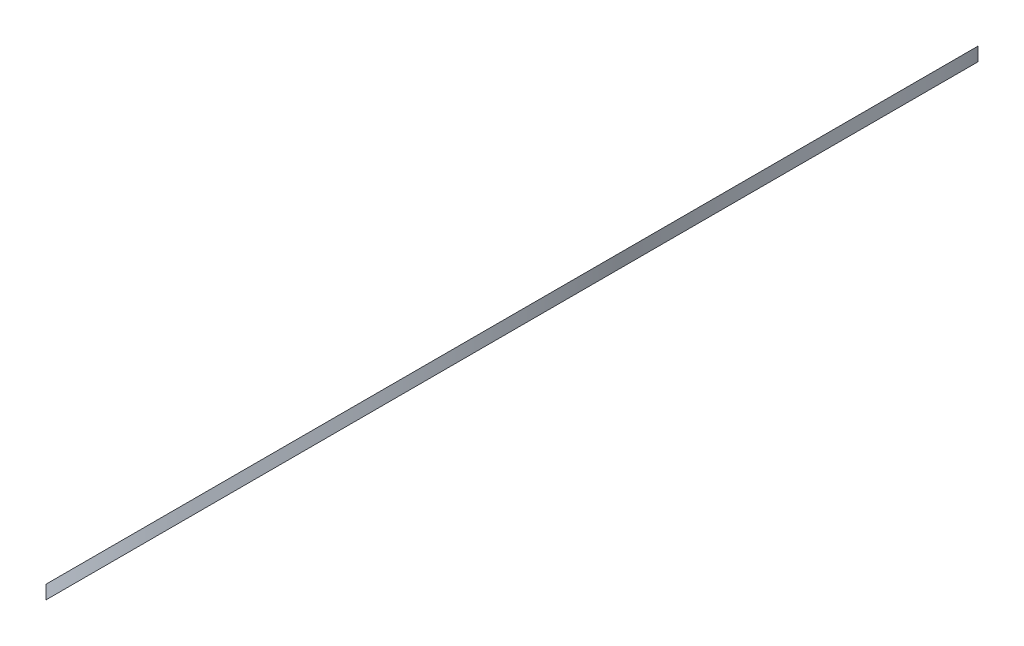
ISO-10303-21;
HEADER;
FILE_DESCRIPTION(('STEP AP214'),'2;1');
FILE_NAME('part.step','',(''),(''),'','','');
FILE_SCHEMA(('AUTOMOTIVE_DESIGN { 1 0 10303 214 1 1 1 1 }'));
ENDSEC;
DATA;
#1=APPLICATION_CONTEXT('core data for automotive mechanical design processes');
#2=APPLICATION_PROTOCOL_DEFINITION('international standard','automotive_design',2000,#1);
#3=PRODUCT_CONTEXT('',#1,'mechanical');
#4=PRODUCT('Part','Part','',(#3));
#5=PRODUCT_RELATED_PRODUCT_CATEGORY('part','',(#4));
#6=PRODUCT_DEFINITION_FORMATION('','',#4);
#7=PRODUCT_DEFINITION_CONTEXT('part definition',#1,'design');
#8=PRODUCT_DEFINITION('design','',#6,#7);
#9=PRODUCT_DEFINITION_SHAPE('','',#8);
#10=(LENGTH_UNIT() NAMED_UNIT(*) SI_UNIT(.MILLI.,.METRE.));
#11=(NAMED_UNIT(*) PLANE_ANGLE_UNIT() SI_UNIT($,.RADIAN.));
#12=(NAMED_UNIT(*) SI_UNIT($,.STERADIAN.) SOLID_ANGLE_UNIT());
#13=UNCERTAINTY_MEASURE_WITH_UNIT(LENGTH_MEASURE(1.E-05),#10,'distance_accuracy_value','');
#14=(GEOMETRIC_REPRESENTATION_CONTEXT(3) GLOBAL_UNCERTAINTY_ASSIGNED_CONTEXT((#13)) GLOBAL_UNIT_ASSIGNED_CONTEXT((#10,
#11,#12)) REPRESENTATION_CONTEXT('',''));
#15=CARTESIAN_POINT('',(0.,0.,0.));
#16=DIRECTION('',(0.,0.,1.));
#17=DIRECTION('',(1.,0.,0.));
#18=AXIS2_PLACEMENT_3D('',#15,#16,#17);
#19=CARTESIAN_POINT('',(0.,112.450142299264,0.));
#20=DIRECTION('',(0.,-1.,0.));
#21=DIRECTION('',(0.,0.,-1.));
#22=AXIS2_PLACEMENT_3D('',#19,#20,#21);
#23=CYLINDRICAL_SURFACE('',#22,35.5);
#24=DIRECTION('',(0.,-1.,0.));
#25=VECTOR('',#24,1.);
#26=CARTESIAN_POINT('',(-14.0836049419712,47.9914080963351,-32.5868389359644));
#27=LINE('',#26,#25);
#28=CARTESIAN_POINT('',(-14.0836049419712,46.3992112506995,-32.5868389359644));
#29=VERTEX_POINT('',#28);
#30=CARTESIAN_POINT('',(-14.0836049419712,44.9849976883264,-32.5868389359644));
#31=VERTEX_POINT('',#30);
#32=EDGE_CURVE('E63',#29,#31,#27,.T.);
#33=ORIENTED_EDGE('',*,*,#32,.F.);
#34=CARTESIAN_POINT('',(0.,60.4828161926706,0.));
#35=DIRECTION('',(-0.707106781186544,0.707106781186551,0.));
#36=DIRECTION('',(-0.707106781186551,-0.707106781186544,0.));
#37=AXIS2_PLACEMENT_3D('',#34,#35,#36);
#38=ELLIPSE('',#37,50.2045814642446,35.5);
#39=CARTESIAN_POINT('',(-14.0836049419712,46.3992112506995,32.5868389359644));
#40=VERTEX_POINT('',#39);
#41=EDGE_CURVE('E81',#29,#40,#38,.F.);
#42=ORIENTED_EDGE('',*,*,#41,.T.);
#43=DIRECTION('',(0.,-1.,0.));
#44=VECTOR('',#43,1.);
#45=CARTESIAN_POINT('',(-14.0836049419712,47.9914080963351,32.5868389359644));
#46=LINE('',#45,#44);
#47=CARTESIAN_POINT('',(-14.0836049419712,44.9849976883264,32.5868389359644));
#48=VERTEX_POINT('',#47);
#49=EDGE_CURVE('E74',#48,#40,#46,.F.);
#50=ORIENTED_EDGE('',*,*,#49,.F.);
#51=CARTESIAN_POINT('',(0.,59.0686026302975,0.));
#52=DIRECTION('',(-0.707106781186544,0.707106781186551,0.));
#53=DIRECTION('',(-0.707106781186551,-0.707106781186544,0.));
#54=AXIS2_PLACEMENT_3D('',#51,#52,#53);
#55=ELLIPSE('',#54,50.2045814642446,35.5);
#56=EDGE_CURVE('E57',#31,#48,#55,.F.);
#57=ORIENTED_EDGE('',*,*,#56,.F.);
#58=EDGE_LOOP('',(#33,#42,#50,#57));
#59=FACE_BOUND('',#58,.T.);
#60=ADVANCED_FACE('F49',(#59),#23,.T.);
#61=CARTESIAN_POINT('',(-30.2414080963353,30.2414080963356,0.));
#62=DIRECTION('',(-0.707106781186544,0.707106781186551,0.));
#63=DIRECTION('',(-0.707106781186551,-0.707106781186544,0.));
#64=AXIS2_PLACEMENT_3D('',#61,#62,#63);
#65=PLANE('',#64);
#66=ORIENTED_EDGE('',*,*,#41,.F.);
#67=CARTESIAN_POINT('',(-67.4160334274763,-6.933217234805,0.));
#68=DIRECTION('',(-0.707106781186544,0.707106781186551,0.));
#69=DIRECTION('',(-0.707106781186551,-0.707106781186544,0.));
#70=AXIS2_PLACEMENT_3D('',#67,#68,#69);
#71=ELLIPSE('',#70,88.388347648318,62.5);
#72=EDGE_CURVE('E68',#29,#40,#71,.F.);
#73=ORIENTED_EDGE('',*,*,#72,.T.);
#74=EDGE_LOOP('',(#66,#73));
#75=FACE_BOUND('',#74,.T.);
#76=ADVANCED_FACE('F51',(#75),#65,.T.);
#77=CARTESIAN_POINT('',(-29.5343013151487,29.534301315149,0.));
#78=DIRECTION('',(-0.707106781186544,0.707106781186551,0.));
#79=DIRECTION('',(-0.707106781186551,-0.707106781186544,0.));
#80=AXIS2_PLACEMENT_3D('',#77,#78,#79);
#81=PLANE('',#80);
#82=CARTESIAN_POINT('',(-67.4160334274763,-8.3474307971781,0.));
#83=DIRECTION('',(-0.707106781186544,0.707106781186551,0.));
#84=DIRECTION('',(-0.707106781186551,-0.707106781186544,0.));
#85=AXIS2_PLACEMENT_3D('',#82,#83,#84);
#86=ELLIPSE('',#85,88.388347648318,62.5);
#87=EDGE_CURVE('E13',#31,#48,#86,.F.);
#88=ORIENTED_EDGE('',*,*,#87,.F.);
#89=ORIENTED_EDGE('',*,*,#56,.T.);
#90=EDGE_LOOP('',(#88,#89));
#91=FACE_BOUND('',#90,.T.);
#92=ADVANCED_FACE('F83',(#91),#81,.F.);
#93=CARTESIAN_POINT('',(-67.4160334274763,23.5686026302978,0.));
#94=DIRECTION('',(0.,-1.,0.));
#95=DIRECTION('',(0.,0.,-1.));
#96=AXIS2_PLACEMENT_3D('',#93,#94,#95);
#97=CYLINDRICAL_SURFACE('',#96,62.5);
#98=ORIENTED_EDGE('',*,*,#32,.T.);
#99=ORIENTED_EDGE('',*,*,#87,.T.);
#100=ORIENTED_EDGE('',*,*,#49,.T.);
#101=ORIENTED_EDGE('',*,*,#72,.F.);
#102=EDGE_LOOP('',(#98,#99,#100,#101));
#103=FACE_BOUND('',#102,.T.);
#104=ADVANCED_FACE('F73',(#103),#97,.F.);
#105=CLOSED_SHELL('',(#60,#76,#92,#104));
#106=MANIFOLD_SOLID_BREP('B2',#105);
#107=ADVANCED_BREP_SHAPE_REPRESENTATION('',(#18,#106),#14);
#108=SHAPE_DEFINITION_REPRESENTATION(#9,#107);
ENDSEC;
END-ISO-10303-21;
